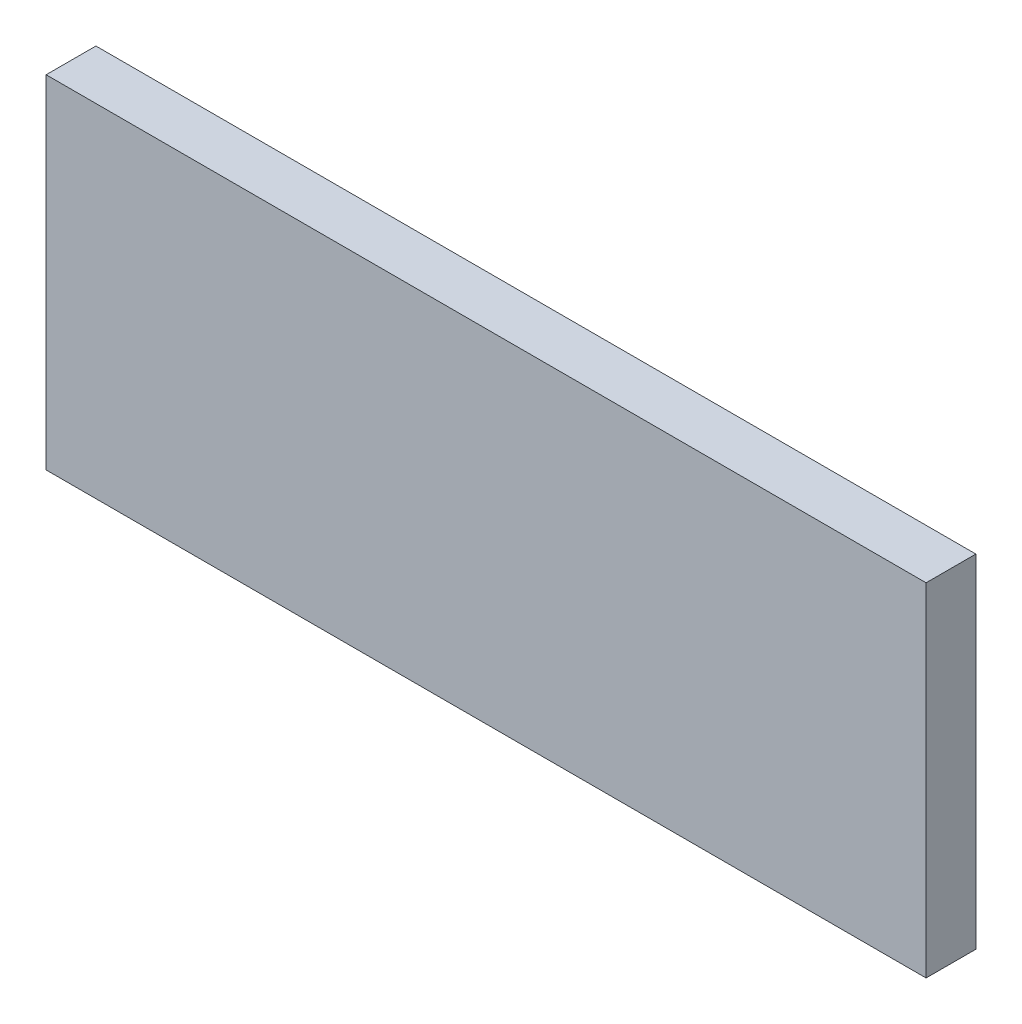
ISO-10303-21;
HEADER;
FILE_DESCRIPTION(('STEP AP214'),'2;1');
FILE_NAME('part.step','',(''),(''),'','','');
FILE_SCHEMA(('AUTOMOTIVE_DESIGN { 1 0 10303 214 1 1 1 1 }'));
ENDSEC;
DATA;
#1=APPLICATION_CONTEXT('core data for automotive mechanical design processes');
#2=APPLICATION_PROTOCOL_DEFINITION('international standard','automotive_design',2000,#1);
#3=PRODUCT_CONTEXT('',#1,'mechanical');
#4=PRODUCT('Part','Part','',(#3));
#5=PRODUCT_RELATED_PRODUCT_CATEGORY('part','',(#4));
#6=PRODUCT_DEFINITION_FORMATION('','',#4);
#7=PRODUCT_DEFINITION_CONTEXT('part definition',#1,'design');
#8=PRODUCT_DEFINITION('design','',#6,#7);
#9=PRODUCT_DEFINITION_SHAPE('','',#8);
#10=(LENGTH_UNIT() NAMED_UNIT(*) SI_UNIT(.MILLI.,.METRE.));
#11=(NAMED_UNIT(*) PLANE_ANGLE_UNIT() SI_UNIT($,.RADIAN.));
#12=(NAMED_UNIT(*) SI_UNIT($,.STERADIAN.) SOLID_ANGLE_UNIT());
#13=UNCERTAINTY_MEASURE_WITH_UNIT(LENGTH_MEASURE(1.E-05),#10,'distance_accuracy_value','');
#14=(GEOMETRIC_REPRESENTATION_CONTEXT(3) GLOBAL_UNCERTAINTY_ASSIGNED_CONTEXT((#13)) GLOBAL_UNIT_ASSIGNED_CONTEXT((#10,
#11,#12)) REPRESENTATION_CONTEXT('',''));
#15=CARTESIAN_POINT('',(0.,0.,0.));
#16=DIRECTION('',(0.,0.,1.));
#17=DIRECTION('',(1.,0.,0.));
#18=AXIS2_PLACEMENT_3D('',#15,#16,#17);
#19=CARTESIAN_POINT('',(0.,0.,0.8));
#20=DIRECTION('',(1.,0.,0.));
#21=DIRECTION('',(0.,1.,0.));
#22=AXIS2_PLACEMENT_3D('',#19,#20,#21);
#23=PLANE('',#22);
#24=DIRECTION('',(0.,-1.,0.));
#25=VECTOR('',#24,1.);
#26=CARTESIAN_POINT('',(0.,0.,0.));
#27=LINE('',#26,#25);
#28=CARTESIAN_POINT('',(0.,0.,0.));
#29=VERTEX_POINT('',#28);
#30=CARTESIAN_POINT('',(0.,-5.5,0.));
#31=VERTEX_POINT('',#30);
#32=EDGE_CURVE('E111',#29,#31,#27,.T.);
#33=ORIENTED_EDGE('',*,*,#32,.T.);
#34=DIRECTION('',(0.,0.,-1.));
#35=VECTOR('',#34,1.);
#36=CARTESIAN_POINT('',(0.,-5.5,0.8));
#37=LINE('',#36,#35);
#38=CARTESIAN_POINT('',(0.,-5.5,0.8));
#39=VERTEX_POINT('',#38);
#40=EDGE_CURVE('E11',#39,#31,#37,.T.);
#41=ORIENTED_EDGE('',*,*,#40,.F.);
#42=DIRECTION('',(0.,-1.,0.));
#43=VECTOR('',#42,1.);
#44=CARTESIAN_POINT('',(0.,0.,0.8));
#45=LINE('',#44,#43);
#46=CARTESIAN_POINT('',(0.,0.,0.8));
#47=VERTEX_POINT('',#46);
#48=EDGE_CURVE('E95',#47,#39,#45,.T.);
#49=ORIENTED_EDGE('',*,*,#48,.F.);
#50=DIRECTION('',(0.,0.,-1.));
#51=VECTOR('',#50,1.);
#52=CARTESIAN_POINT('',(0.,0.,0.8));
#53=LINE('',#52,#51);
#54=EDGE_CURVE('E107',#47,#29,#53,.T.);
#55=ORIENTED_EDGE('',*,*,#54,.T.);
#56=EDGE_LOOP('',(#33,#41,#49,#55));
#57=FACE_BOUND('',#56,.T.);
#58=ADVANCED_FACE('F43',(#57),#23,.F.);
#59=CARTESIAN_POINT('',(0.,-5.5,0.8));
#60=DIRECTION('',(0.,1.,0.));
#61=DIRECTION('',(0.,0.,1.));
#62=AXIS2_PLACEMENT_3D('',#59,#60,#61);
#63=PLANE('',#62);
#64=DIRECTION('',(1.,0.,0.));
#65=VECTOR('',#64,1.);
#66=CARTESIAN_POINT('',(0.,-5.5,0.));
#67=LINE('',#66,#65);
#68=CARTESIAN_POINT('',(14.14,-5.5,0.));
#69=VERTEX_POINT('',#68);
#70=EDGE_CURVE('E100',#31,#69,#67,.T.);
#71=ORIENTED_EDGE('',*,*,#70,.T.);
#72=DIRECTION('',(0.,0.,-1.));
#73=VECTOR('',#72,1.);
#74=CARTESIAN_POINT('',(14.14,-5.5,0.8));
#75=LINE('',#74,#73);
#76=CARTESIAN_POINT('',(14.14,-5.5,0.8));
#77=VERTEX_POINT('',#76);
#78=EDGE_CURVE('E52',#77,#69,#75,.T.);
#79=ORIENTED_EDGE('',*,*,#78,.F.);
#80=DIRECTION('',(1.,0.,0.));
#81=VECTOR('',#80,1.);
#82=CARTESIAN_POINT('',(0.,-5.5,0.8));
#83=LINE('',#82,#81);
#84=EDGE_CURVE('E90',#39,#77,#83,.T.);
#85=ORIENTED_EDGE('',*,*,#84,.F.);
#86=ORIENTED_EDGE('',*,*,#40,.T.);
#87=EDGE_LOOP('',(#71,#79,#85,#86));
#88=FACE_BOUND('',#87,.T.);
#89=ADVANCED_FACE('F99',(#88),#63,.F.);
#90=CARTESIAN_POINT('',(14.14,0.,0.8));
#91=DIRECTION('',(-1.,0.,0.));
#92=DIRECTION('',(0.,0.,1.));
#93=AXIS2_PLACEMENT_3D('',#90,#91,#92);
#94=PLANE('',#93);
#95=DIRECTION('',(0.,1.,0.));
#96=VECTOR('',#95,1.);
#97=CARTESIAN_POINT('',(14.14,0.,0.));
#98=LINE('',#97,#96);
#99=CARTESIAN_POINT('',(14.14,0.,0.));
#100=VERTEX_POINT('',#99);
#101=EDGE_CURVE('E77',#69,#100,#98,.T.);
#102=ORIENTED_EDGE('',*,*,#101,.T.);
#103=DIRECTION('',(0.,0.,-1.));
#104=VECTOR('',#103,1.);
#105=CARTESIAN_POINT('',(14.14,0.,0.8));
#106=LINE('',#105,#104);
#107=CARTESIAN_POINT('',(14.14,0.,0.8));
#108=VERTEX_POINT('',#107);
#109=EDGE_CURVE('E102',#108,#100,#106,.T.);
#110=ORIENTED_EDGE('',*,*,#109,.F.);
#111=DIRECTION('',(0.,1.,0.));
#112=VECTOR('',#111,1.);
#113=CARTESIAN_POINT('',(14.14,0.,0.8));
#114=LINE('',#113,#112);
#115=EDGE_CURVE('E93',#77,#108,#114,.T.);
#116=ORIENTED_EDGE('',*,*,#115,.F.);
#117=ORIENTED_EDGE('',*,*,#78,.T.);
#118=EDGE_LOOP('',(#102,#110,#116,#117));
#119=FACE_BOUND('',#118,.T.);
#120=ADVANCED_FACE('F103',(#119),#94,.F.);
#121=CARTESIAN_POINT('',(0.,0.,0.8));
#122=DIRECTION('',(0.,-1.,0.));
#123=DIRECTION('',(0.,0.,-1.));
#124=AXIS2_PLACEMENT_3D('',#121,#122,#123);
#125=PLANE('',#124);
#126=DIRECTION('',(-1.,0.,0.));
#127=VECTOR('',#126,1.);
#128=CARTESIAN_POINT('',(0.,0.,0.));
#129=LINE('',#128,#127);
#130=EDGE_CURVE('E83',#100,#29,#129,.T.);
#131=ORIENTED_EDGE('',*,*,#130,.T.);
#132=ORIENTED_EDGE('',*,*,#54,.F.);
#133=DIRECTION('',(-1.,0.,0.));
#134=VECTOR('',#133,1.);
#135=CARTESIAN_POINT('',(0.,0.,0.8));
#136=LINE('',#135,#134);
#137=EDGE_CURVE('E60',#108,#47,#136,.T.);
#138=ORIENTED_EDGE('',*,*,#137,.F.);
#139=ORIENTED_EDGE('',*,*,#109,.T.);
#140=EDGE_LOOP('',(#131,#132,#138,#139));
#141=FACE_BOUND('',#140,.T.);
#142=ADVANCED_FACE('F124',(#141),#125,.F.);
#143=CARTESIAN_POINT('',(0.,0.,0.8));
#144=DIRECTION('',(0.,0.,1.));
#145=DIRECTION('',(1.,0.,0.));
#146=AXIS2_PLACEMENT_3D('',#143,#144,#145);
#147=PLANE('',#146);
#148=ORIENTED_EDGE('',*,*,#48,.T.);
#149=ORIENTED_EDGE('',*,*,#84,.T.);
#150=ORIENTED_EDGE('',*,*,#115,.T.);
#151=ORIENTED_EDGE('',*,*,#137,.T.);
#152=EDGE_LOOP('',(#148,#149,#150,#151));
#153=FACE_BOUND('',#152,.T.);
#154=ADVANCED_FACE('F91',(#153),#147,.T.);
#155=CARTESIAN_POINT('',(0.,0.,0.));
#156=DIRECTION('',(0.,0.,1.));
#157=DIRECTION('',(1.,0.,0.));
#158=AXIS2_PLACEMENT_3D('',#155,#156,#157);
#159=PLANE('',#158);
#160=ORIENTED_EDGE('',*,*,#32,.F.);
#161=ORIENTED_EDGE('',*,*,#130,.F.);
#162=ORIENTED_EDGE('',*,*,#101,.F.);
#163=ORIENTED_EDGE('',*,*,#70,.F.);
#164=EDGE_LOOP('',(#160,#161,#162,#163));
#165=FACE_BOUND('',#164,.T.);
#166=ADVANCED_FACE('F127',(#165),#159,.F.);
#167=CLOSED_SHELL('',(#58,#89,#120,#142,#154,#166));
#168=MANIFOLD_SOLID_BREP('B2',#167);
#169=ADVANCED_BREP_SHAPE_REPRESENTATION('',(#18,#168),#14);
#170=SHAPE_DEFINITION_REPRESENTATION(#9,#169);
ENDSEC;
END-ISO-10303-21;
